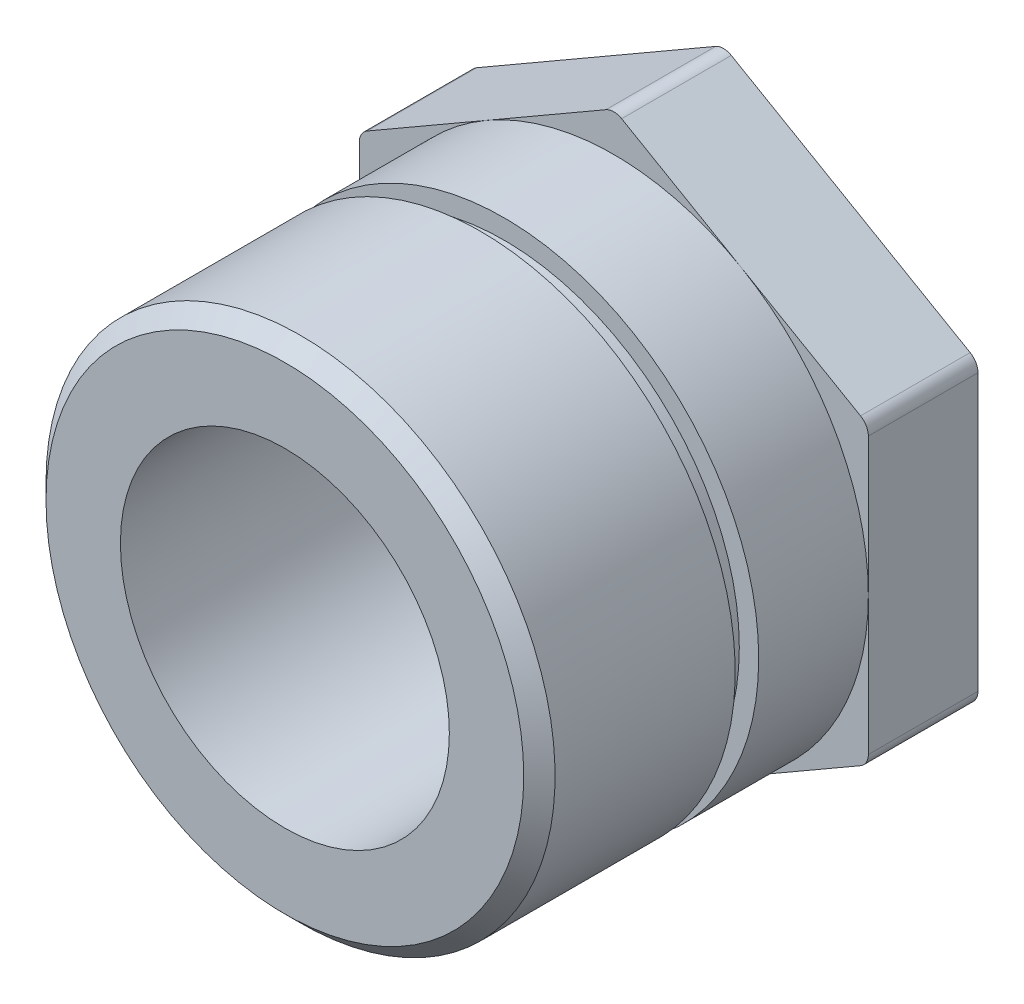
ISO-10303-21;
HEADER;
FILE_DESCRIPTION(('STEP AP214'),'2;1');
FILE_NAME('part.step','',(''),(''),'','','');
FILE_SCHEMA(('AUTOMOTIVE_DESIGN { 1 0 10303 214 1 1 1 1 }'));
ENDSEC;
DATA;
#1=APPLICATION_CONTEXT('core data for automotive mechanical design processes');
#2=APPLICATION_PROTOCOL_DEFINITION('international standard','automotive_design',2000,#1);
#3=PRODUCT_CONTEXT('',#1,'mechanical');
#4=PRODUCT('Part','Part','',(#3));
#5=PRODUCT_RELATED_PRODUCT_CATEGORY('part','',(#4));
#6=PRODUCT_DEFINITION_FORMATION('','',#4);
#7=PRODUCT_DEFINITION_CONTEXT('part definition',#1,'design');
#8=PRODUCT_DEFINITION('design','',#6,#7);
#9=PRODUCT_DEFINITION_SHAPE('','',#8);
#10=(LENGTH_UNIT() NAMED_UNIT(*) SI_UNIT(.MILLI.,.METRE.));
#11=(NAMED_UNIT(*) PLANE_ANGLE_UNIT() SI_UNIT($,.RADIAN.));
#12=(NAMED_UNIT(*) SI_UNIT($,.STERADIAN.) SOLID_ANGLE_UNIT());
#13=UNCERTAINTY_MEASURE_WITH_UNIT(LENGTH_MEASURE(1.E-05),#10,'distance_accuracy_value','');
#14=(GEOMETRIC_REPRESENTATION_CONTEXT(3) GLOBAL_UNCERTAINTY_ASSIGNED_CONTEXT((#13)) GLOBAL_UNIT_ASSIGNED_CONTEXT((#10,
#11,#12)) REPRESENTATION_CONTEXT('',''));
#15=CARTESIAN_POINT('',(0.,0.,0.));
#16=DIRECTION('',(0.,0.,1.));
#17=DIRECTION('',(1.,0.,0.));
#18=AXIS2_PLACEMENT_3D('',#15,#16,#17);
#19=CARTESIAN_POINT('',(0.,0.,42.));
#20=DIRECTION('',(0.,0.,-1.));
#21=DIRECTION('',(-1.,0.,0.));
#22=AXIS2_PLACEMENT_3D('',#19,#20,#21);
#23=CYLINDRICAL_SURFACE('',#22,32.5);
#24=CARTESIAN_POINT('',(0.,0.,40.0000000000001));
#25=DIRECTION('',(0.,0.,1.));
#26=DIRECTION('',(1.,0.,0.));
#27=AXIS2_PLACEMENT_3D('',#24,#25,#26);
#28=CIRCLE('',#27,32.5);
#29=CARTESIAN_POINT('',(-32.5,0.,40.0000000000001));
#30=VERTEX_POINT('',#29);
#31=EDGE_CURVE('E11',#30,#30,#28,.F.);
#32=CARTESIAN_POINT('',(0.,0.,17.));
#33=DIRECTION('',(0.,0.,1.));
#34=DIRECTION('',(1.,0.,0.));
#35=AXIS2_PLACEMENT_3D('',#32,#33,#34);
#36=CIRCLE('',#35,32.5);
#37=CARTESIAN_POINT('',(-32.5,0.,17.));
#38=VERTEX_POINT('',#37);
#39=EDGE_CURVE('E303',#38,#38,#36,.T.);
#40=CARTESIAN_POINT('',(-32.5,0.,40.0000000000001));
#41=CARTESIAN_POINT('',(-32.5,0.,39.7604166666667));
#42=CARTESIAN_POINT('',(-32.5,0.,39.5208333333334));
#43=CARTESIAN_POINT('',(-32.5,0.,39.0416666666667));
#44=CARTESIAN_POINT('',(-32.5,0.,38.8020833333334));
#45=CARTESIAN_POINT('',(-32.5,0.,38.3229166666667));
#46=CARTESIAN_POINT('',(-32.5,0.,38.0833333333334));
#47=CARTESIAN_POINT('',(-32.5,0.,37.6041666666667));
#48=CARTESIAN_POINT('',(-32.5,0.,37.3645833333334));
#49=CARTESIAN_POINT('',(-32.5,0.,36.8854166666667));
#50=CARTESIAN_POINT('',(-32.5,0.,36.6458333333334));
#51=CARTESIAN_POINT('',(-32.5,0.,36.1666666666667));
#52=CARTESIAN_POINT('',(-32.5,0.,35.9270833333334));
#53=CARTESIAN_POINT('',(-32.5,0.,35.4479166666667));
#54=CARTESIAN_POINT('',(-32.5,0.,35.2083333333334));
#55=CARTESIAN_POINT('',(-32.5,0.,34.7291666666667));
#56=CARTESIAN_POINT('',(-32.5,0.,34.4895833333334));
#57=CARTESIAN_POINT('',(-32.5,0.,34.0104166666667));
#58=CARTESIAN_POINT('',(-32.5,0.,33.7708333333334));
#59=CARTESIAN_POINT('',(-32.5,0.,33.2916666666667));
#60=CARTESIAN_POINT('',(-32.5,0.,33.0520833333334));
#61=CARTESIAN_POINT('',(-32.5,0.,32.5729166666667));
#62=CARTESIAN_POINT('',(-32.5,0.,32.3333333333334));
#63=CARTESIAN_POINT('',(-32.5,0.,31.8541666666667));
#64=CARTESIAN_POINT('',(-32.5,0.,31.6145833333334));
#65=CARTESIAN_POINT('',(-32.5,0.,31.1354166666667));
#66=CARTESIAN_POINT('',(-32.5,0.,30.8958333333334));
#67=CARTESIAN_POINT('',(-32.5,0.,30.4166666666667));
#68=CARTESIAN_POINT('',(-32.5,0.,30.1770833333334));
#69=CARTESIAN_POINT('',(-32.5,0.,29.6979166666667));
#70=CARTESIAN_POINT('',(-32.5,0.,29.4583333333334));
#71=CARTESIAN_POINT('',(-32.5,0.,28.9791666666667));
#72=CARTESIAN_POINT('',(-32.5,0.,28.7395833333334));
#73=CARTESIAN_POINT('',(-32.5,0.,28.2604166666667));
#74=CARTESIAN_POINT('',(-32.5,0.,28.0208333333334));
#75=CARTESIAN_POINT('',(-32.5,0.,27.5416666666667));
#76=CARTESIAN_POINT('',(-32.5,0.,27.3020833333334));
#77=CARTESIAN_POINT('',(-32.5,0.,26.8229166666667));
#78=CARTESIAN_POINT('',(-32.5,0.,26.5833333333333));
#79=CARTESIAN_POINT('',(-32.5,0.,26.1041666666667));
#80=CARTESIAN_POINT('',(-32.5,0.,25.8645833333333));
#81=CARTESIAN_POINT('',(-32.5,0.,25.3854166666667));
#82=CARTESIAN_POINT('',(-32.5,0.,25.1458333333333));
#83=CARTESIAN_POINT('',(-32.5,0.,24.6666666666667));
#84=CARTESIAN_POINT('',(-32.5,0.,24.4270833333333));
#85=CARTESIAN_POINT('',(-32.5,0.,23.9479166666667));
#86=CARTESIAN_POINT('',(-32.5,0.,23.7083333333333));
#87=CARTESIAN_POINT('',(-32.5,0.,23.2291666666667));
#88=CARTESIAN_POINT('',(-32.5,0.,22.9895833333333));
#89=CARTESIAN_POINT('',(-32.5,0.,22.5104166666667));
#90=CARTESIAN_POINT('',(-32.5,0.,22.2708333333333));
#91=CARTESIAN_POINT('',(-32.5,0.,21.7916666666667));
#92=CARTESIAN_POINT('',(-32.5,0.,21.5520833333333));
#93=CARTESIAN_POINT('',(-32.5,0.,21.0729166666667));
#94=CARTESIAN_POINT('',(-32.5,0.,20.8333333333333));
#95=CARTESIAN_POINT('',(-32.5,0.,20.3541666666667));
#96=CARTESIAN_POINT('',(-32.5,0.,20.1145833333333));
#97=CARTESIAN_POINT('',(-32.5,0.,19.6354166666667));
#98=CARTESIAN_POINT('',(-32.5,0.,19.3958333333333));
#99=CARTESIAN_POINT('',(-32.5,0.,18.9166666666667));
#100=CARTESIAN_POINT('',(-32.5,0.,18.6770833333333));
#101=CARTESIAN_POINT('',(-32.5,0.,18.1979166666667));
#102=CARTESIAN_POINT('',(-32.5,0.,17.9583333333333));
#103=CARTESIAN_POINT('',(-32.5,0.,17.4791666666667));
#104=CARTESIAN_POINT('',(-32.5,0.,17.2395833333333));
#105=CARTESIAN_POINT('',(-32.5,0.,17.));
#106=B_SPLINE_CURVE_WITH_KNOTS('',3,(#40,#41,#42,#43,#44,#45,#46,#47,#48,#49,#50,#51,#52,#53,
#54,#55,#56,#57,#58,#59,#60,#61,#62,#63,#64,#65,#66,#67,#68,#69,#70,#71,#72,#73,#74,#75,#76,#77,
#78,#79,#80,#81,#82,#83,#84,#85,#86,#87,#88,#89,#90,#91,#92,#93,#94,#95,#96,#97,#98,#99,#100,
#101,#102,#103,#104,#105),.UNSPECIFIED.,.F.,.F.,(4,2,2,2,2,2,2,2,2,2,2,2,2,2,2,2,2,2,2,2,2,2,2,
2,2,2,2,2,2,2,2,2,4),(0.,0.718750000000004,1.43750000000001,2.15625000000001,2.87500000000001,
3.59375000000001,4.31250000000002,5.03125000000002,5.75000000000002,6.46875000000002,
7.18750000000002,7.90625000000002,8.62500000000003,9.34375000000003,10.0625,10.78125,11.5,
12.21875,12.9375,13.65625,14.375,15.09375,15.8125,16.53125,17.25,17.96875,18.6875000000001,
19.4062500000001,20.1250000000001,20.8437500000001,21.5625000000001,22.2812500000001,
23.0000000000001),.UNSPECIFIED.);
#107=EDGE_CURVE('BSEAM43',#30,#38,#106,.T.);
#108=ORIENTED_EDGE('',*,*,#31,.T.);
#109=ORIENTED_EDGE('',*,*,#39,.T.);
#110=ORIENTED_EDGE('',*,*,#107,.T.);
#111=ORIENTED_EDGE('',*,*,#107,.F.);
#112=EDGE_LOOP('',(#108,#110,#109,#111));
#113=FACE_BOUND('',#112,.T.);
#114=ADVANCED_FACE('F43',(#113),#23,.T.);
#115=CARTESIAN_POINT('',(0.,0.,42.));
#116=DIRECTION('',(0.,0.,1.));
#117=DIRECTION('',(1.,0.,0.));
#118=AXIS2_PLACEMENT_3D('',#115,#116,#117);
#119=PLANE('',#118);
#120=CARTESIAN_POINT('',(0.,0.,42.));
#121=DIRECTION('',(0.,0.,1.));
#122=DIRECTION('',(1.,0.,0.));
#123=AXIS2_PLACEMENT_3D('',#120,#121,#122);
#124=CIRCLE('',#123,21.);
#125=CARTESIAN_POINT('',(21.,0.,42.));
#126=VERTEX_POINT('',#125);
#127=EDGE_CURVE('E355',#126,#126,#124,.T.);
#128=ORIENTED_EDGE('',*,*,#127,.F.);
#129=EDGE_LOOP('',(#128));
#130=FACE_BOUND('',#129,.T.);
#131=CARTESIAN_POINT('',(0.,0.,42.));
#132=DIRECTION('',(0.,0.,1.));
#133=DIRECTION('',(1.,0.,0.));
#134=AXIS2_PLACEMENT_3D('',#131,#132,#133);
#135=CIRCLE('',#134,30.5);
#136=CARTESIAN_POINT('',(30.5,0.,42.));
#137=VERTEX_POINT('',#136);
#138=EDGE_CURVE('E52',#137,#137,#135,.T.);
#139=ORIENTED_EDGE('',*,*,#138,.T.);
#140=EDGE_LOOP('',(#139));
#141=FACE_BOUND('',#140,.T.);
#142=ADVANCED_FACE('F244',(#130,#141),#119,.T.);
#143=CARTESIAN_POINT('',(0.,0.,17.));
#144=DIRECTION('',(0.,0.,1.));
#145=DIRECTION('',(1.,0.,0.));
#146=AXIS2_PLACEMENT_3D('',#143,#144,#145);
#147=PLANE('',#146);
#148=ORIENTED_EDGE('',*,*,#39,.F.);
#149=EDGE_LOOP('',(#148));
#150=FACE_BOUND('',#149,.T.);
#151=CARTESIAN_POINT('',(0.,0.,17.));
#152=DIRECTION('',(0.,0.,1.));
#153=DIRECTION('',(1.,0.,0.));
#154=AXIS2_PLACEMENT_3D('',#151,#152,#153);
#155=CIRCLE('',#154,30.0241150466177);
#156=CARTESIAN_POINT('',(30.0241150466177,0.,17.));
#157=VERTEX_POINT('',#156);
#158=EDGE_CURVE('E305',#157,#157,#155,.T.);
#159=ORIENTED_EDGE('',*,*,#158,.T.);
#160=EDGE_LOOP('',(#159));
#161=FACE_BOUND('',#160,.T.);
#162=ADVANCED_FACE('F267',(#150,#161),#147,.F.);
#163=CARTESIAN_POINT('',(0.,0.,14.));
#164=DIRECTION('',(0.,0.,1.));
#165=DIRECTION('',(1.,0.,0.));
#166=AXIS2_PLACEMENT_3D('',#163,#164,#165);
#167=PLANE('',#166);
#168=CARTESIAN_POINT('',(0.,0.,14.));
#169=DIRECTION('',(0.,0.,1.));
#170=DIRECTION('',(1.,0.,0.));
#171=AXIS2_PLACEMENT_3D('',#168,#169,#170);
#172=CIRCLE('',#171,32.5);
#173=CARTESIAN_POINT('',(32.5,0.,14.));
#174=VERTEX_POINT('',#173);
#175=EDGE_CURVE('E192',#174,#174,#172,.T.);
#176=ORIENTED_EDGE('',*,*,#175,.T.);
#177=EDGE_LOOP('',(#176));
#178=FACE_BOUND('',#177,.T.);
#179=CARTESIAN_POINT('',(0.,0.,14.));
#180=DIRECTION('',(0.,0.,1.));
#181=DIRECTION('',(1.,0.,0.));
#182=AXIS2_PLACEMENT_3D('',#179,#180,#181);
#183=CIRCLE('',#182,30.0241150466177);
#184=CARTESIAN_POINT('',(30.0241150466177,0.,14.));
#185=VERTEX_POINT('',#184);
#186=EDGE_CURVE('E306',#185,#185,#183,.T.);
#187=ORIENTED_EDGE('',*,*,#186,.F.);
#188=EDGE_LOOP('',(#187));
#189=FACE_BOUND('',#188,.T.);
#190=ADVANCED_FACE('F283',(#178,#189),#167,.T.);
#191=CARTESIAN_POINT('',(0.,0.,17.));
#192=DIRECTION('',(0.,0.,-1.));
#193=DIRECTION('',(-1.,0.,0.));
#194=AXIS2_PLACEMENT_3D('',#191,#192,#193);
#195=CYLINDRICAL_SURFACE('',#194,30.0241150466177);
#196=ORIENTED_EDGE('',*,*,#158,.F.);
#197=EDGE_LOOP('',(#196));
#198=FACE_BOUND('',#197,.T.);
#199=ORIENTED_EDGE('',*,*,#186,.T.);
#200=EDGE_LOOP('',(#199));
#201=FACE_BOUND('',#200,.T.);
#202=ADVANCED_FACE('F274',(#198,#201),#195,.T.);
#203=CARTESIAN_POINT('',(0.,0.,0.));
#204=DIRECTION('',(0.,0.,1.));
#205=DIRECTION('',(1.,0.,0.));
#206=AXIS2_PLACEMENT_3D('',#203,#204,#205);
#207=CIRCLE('',#206,32.5);
#208=CARTESIAN_POINT('',(32.5,0.,0.));
#209=VERTEX_POINT('',#208);
#210=CARTESIAN_POINT('',(16.25,28.1458256229943,0.));
#211=VERTEX_POINT('',#210);
#212=EDGE_CURVE('E187',#209,#211,#207,.T.);
#213=ORIENTED_EDGE('',*,*,#212,.T.);
#214=CARTESIAN_POINT('',(-16.25,28.1458256229943,0.));
#215=VERTEX_POINT('',#214);
#216=EDGE_CURVE('E174',#211,#215,#207,.T.);
#217=ORIENTED_EDGE('',*,*,#216,.T.);
#218=CARTESIAN_POINT('',(-32.5,0.,0.));
#219=VERTEX_POINT('',#218);
#220=EDGE_CURVE('E167',#215,#219,#207,.T.);
#221=ORIENTED_EDGE('',*,*,#220,.T.);
#222=CARTESIAN_POINT('',(-16.25,-28.1458256229943,0.));
#223=VERTEX_POINT('',#222);
#224=EDGE_CURVE('E175',#219,#223,#207,.T.);
#225=ORIENTED_EDGE('',*,*,#224,.T.);
#226=CARTESIAN_POINT('',(16.25,-28.1458256229943,0.));
#227=VERTEX_POINT('',#226);
#228=EDGE_CURVE('E315',#223,#227,#207,.T.);
#229=ORIENTED_EDGE('',*,*,#228,.T.);
#230=EDGE_CURVE('E189',#227,#209,#207,.T.);
#231=ORIENTED_EDGE('',*,*,#230,.T.);
#232=EDGE_LOOP('',(#213,#217,#221,#225,#229,#231));
#233=FACE_BOUND('',#232,.T.);
#234=ORIENTED_EDGE('',*,*,#175,.F.);
#235=EDGE_LOOP('',(#234));
#236=FACE_BOUND('',#235,.T.);
#237=ADVANCED_FACE('F183',(#233,#236),#23,.T.);
#238=CARTESIAN_POINT('',(0.,0.,0.));
#239=DIRECTION('',(0.,0.,-1.));
#240=DIRECTION('',(-1.,0.,0.));
#241=AXIS2_PLACEMENT_3D('',#238,#239,#240);
#242=PLANE('',#241);
#243=DIRECTION('',(0.,-1.,0.));
#244=VECTOR('',#243,1.);
#245=CARTESIAN_POINT('',(32.5,18.7638837486628,0.));
#246=LINE('',#245,#244);
#247=CARTESIAN_POINT('',(32.5,17.6091832102836,0.));
#248=VERTEX_POINT('',#247);
#249=EDGE_CURVE('E333',#248,#209,#246,.T.);
#250=ORIENTED_EDGE('',*,*,#249,.F.);
#251=CARTESIAN_POINT('',(30.5,17.6091832102836,0.));
#252=DIRECTION('',(0.,0.,-1.));
#253=DIRECTION('',(-1.,0.,0.));
#254=AXIS2_PLACEMENT_3D('',#251,#252,#253);
#255=CIRCLE('',#254,2.);
#256=CARTESIAN_POINT('',(31.5,19.3412340178525,0.));
#257=VERTEX_POINT('',#256);
#258=EDGE_CURVE('E67',#248,#257,#255,.F.);
#259=ORIENTED_EDGE('',*,*,#258,.T.);
#260=DIRECTION('',(0.866025403784439,-0.5,0.));
#261=VECTOR('',#260,1.);
#262=CARTESIAN_POINT('',(0.,37.5277674973257,0.));
#263=LINE('',#262,#261);
#264=EDGE_CURVE('E163',#211,#257,#263,.T.);
#265=ORIENTED_EDGE('',*,*,#264,.F.);
#266=ORIENTED_EDGE('',*,*,#212,.F.);
#267=EDGE_LOOP('',(#250,#259,#265,#266));
#268=FACE_BOUND('',#267,.T.);
#269=ADVANCED_FACE('F273',(#268),#242,.F.);
#270=CARTESIAN_POINT('',(1.,36.950417228136,0.));
#271=VERTEX_POINT('',#270);
#272=EDGE_CURVE('E336',#271,#211,#263,.T.);
#273=ORIENTED_EDGE('',*,*,#272,.F.);
#274=CARTESIAN_POINT('',(0.,35.2183664205672,0.));
#275=DIRECTION('',(0.,0.,-1.));
#276=DIRECTION('',(-1.,0.,0.));
#277=AXIS2_PLACEMENT_3D('',#274,#275,#276);
#278=CIRCLE('',#277,2.);
#279=CARTESIAN_POINT('',(-1.,36.950417228136,0.));
#280=VERTEX_POINT('',#279);
#281=EDGE_CURVE('E59',#271,#280,#278,.F.);
#282=ORIENTED_EDGE('',*,*,#281,.T.);
#283=DIRECTION('',(0.866025403784439,0.5,0.));
#284=VECTOR('',#283,1.);
#285=CARTESIAN_POINT('',(-32.5,18.7638837486628,0.));
#286=LINE('',#285,#284);
#287=EDGE_CURVE('E159',#215,#280,#286,.T.);
#288=ORIENTED_EDGE('',*,*,#287,.F.);
#289=ORIENTED_EDGE('',*,*,#216,.F.);
#290=EDGE_LOOP('',(#273,#282,#288,#289));
#291=FACE_BOUND('',#290,.T.);
#292=ADVANCED_FACE('F180',(#291),#242,.F.);
#293=CARTESIAN_POINT('',(-31.5,19.3412340178525,0.));
#294=VERTEX_POINT('',#293);
#295=EDGE_CURVE('E154',#294,#215,#286,.T.);
#296=ORIENTED_EDGE('',*,*,#295,.F.);
#297=CARTESIAN_POINT('',(-30.5,17.6091832102836,0.));
#298=DIRECTION('',(0.,0.,-1.));
#299=DIRECTION('',(-1.,0.,0.));
#300=AXIS2_PLACEMENT_3D('',#297,#298,#299);
#301=CIRCLE('',#300,2.);
#302=CARTESIAN_POINT('',(-32.5,17.6091832102836,0.));
#303=VERTEX_POINT('',#302);
#304=EDGE_CURVE('E196',#294,#303,#301,.F.);
#305=ORIENTED_EDGE('',*,*,#304,.T.);
#306=DIRECTION('',(0.,1.,0.));
#307=VECTOR('',#306,1.);
#308=CARTESIAN_POINT('',(-32.5,-18.7638837486628,0.));
#309=LINE('',#308,#307);
#310=EDGE_CURVE('E170',#219,#303,#309,.T.);
#311=ORIENTED_EDGE('',*,*,#310,.F.);
#312=ORIENTED_EDGE('',*,*,#220,.F.);
#313=EDGE_LOOP('',(#296,#305,#311,#312));
#314=FACE_BOUND('',#313,.T.);
#315=ADVANCED_FACE('F168',(#314),#242,.F.);
#316=CARTESIAN_POINT('',(-32.5,-17.6091832102836,0.));
#317=VERTEX_POINT('',#316);
#318=EDGE_CURVE('E313',#317,#219,#309,.T.);
#319=ORIENTED_EDGE('',*,*,#318,.F.);
#320=CARTESIAN_POINT('',(-30.5,-17.6091832102836,0.));
#321=DIRECTION('',(0.,0.,-1.));
#322=DIRECTION('',(-1.,0.,0.));
#323=AXIS2_PLACEMENT_3D('',#320,#321,#322);
#324=CIRCLE('',#323,2.);
#325=CARTESIAN_POINT('',(-31.5,-19.3412340178525,0.));
#326=VERTEX_POINT('',#325);
#327=EDGE_CURVE('E240',#317,#326,#324,.F.);
#328=ORIENTED_EDGE('',*,*,#327,.T.);
#329=DIRECTION('',(-0.866025403784439,0.5,0.));
#330=VECTOR('',#329,1.);
#331=CARTESIAN_POINT('',(0.,-37.5277674973257,0.));
#332=LINE('',#331,#330);
#333=EDGE_CURVE('E325',#223,#326,#332,.T.);
#334=ORIENTED_EDGE('',*,*,#333,.F.);
#335=ORIENTED_EDGE('',*,*,#224,.F.);
#336=EDGE_LOOP('',(#319,#328,#334,#335));
#337=FACE_BOUND('',#336,.T.);
#338=ADVANCED_FACE('F323',(#337),#242,.F.);
#339=CARTESIAN_POINT('',(-0.999999999999999,-36.950417228136,0.));
#340=VERTEX_POINT('',#339);
#341=EDGE_CURVE('E328',#340,#223,#332,.T.);
#342=ORIENTED_EDGE('',*,*,#341,.F.);
#343=CARTESIAN_POINT('',(0.,-35.2183664205672,0.));
#344=DIRECTION('',(0.,0.,-1.));
#345=DIRECTION('',(-1.,0.,0.));
#346=AXIS2_PLACEMENT_3D('',#343,#344,#345);
#347=CIRCLE('',#346,2.);
#348=CARTESIAN_POINT('',(1.00000000000001,-36.950417228136,0.));
#349=VERTEX_POINT('',#348);
#350=EDGE_CURVE('E220',#340,#349,#347,.F.);
#351=ORIENTED_EDGE('',*,*,#350,.T.);
#352=DIRECTION('',(-0.866025403784439,-0.5,0.));
#353=VECTOR('',#352,1.);
#354=CARTESIAN_POINT('',(32.5,-18.7638837486628,0.));
#355=LINE('',#354,#353);
#356=EDGE_CURVE('E330',#227,#349,#355,.T.);
#357=ORIENTED_EDGE('',*,*,#356,.F.);
#358=ORIENTED_EDGE('',*,*,#228,.F.);
#359=EDGE_LOOP('',(#342,#351,#357,#358));
#360=FACE_BOUND('',#359,.T.);
#361=ADVANCED_FACE('F386',(#360),#242,.F.);
#362=CARTESIAN_POINT('',(-32.5,18.7638837486628,-14.));
#363=DIRECTION('',(0.5,-0.866025403784439,0.));
#364=DIRECTION('',(0.866025403784439,0.5,0.));
#365=AXIS2_PLACEMENT_3D('',#362,#363,#364);
#366=PLANE('',#365);
#367=DIRECTION('',(0.866025403784439,0.5,0.));
#368=VECTOR('',#367,1.);
#369=CARTESIAN_POINT('',(-32.5,18.7638837486628,-14.));
#370=LINE('',#369,#368);
#371=CARTESIAN_POINT('',(-31.5,19.3412340178525,-14.));
#372=VERTEX_POINT('',#371);
#373=CARTESIAN_POINT('',(-1.,36.950417228136,-14.));
#374=VERTEX_POINT('',#373);
#375=EDGE_CURVE('E352',#372,#374,#370,.T.);
#376=ORIENTED_EDGE('',*,*,#375,.F.);
#377=DIRECTION('',(0.,0.,1.));
#378=VECTOR('',#377,1.);
#379=CARTESIAN_POINT('',(-31.5,19.3412340178525,-14.));
#380=LINE('',#379,#378);
#381=EDGE_CURVE('E161',#372,#294,#380,.T.);
#382=ORIENTED_EDGE('',*,*,#381,.T.);
#383=ORIENTED_EDGE('',*,*,#295,.T.);
#384=ORIENTED_EDGE('',*,*,#287,.T.);
#385=DIRECTION('',(0.,0.,1.));
#386=VECTOR('',#385,1.);
#387=CARTESIAN_POINT('',(-1.,36.950417228136,-14.));
#388=LINE('',#387,#386);
#389=EDGE_CURVE('E188',#280,#374,#388,.F.);
#390=ORIENTED_EDGE('',*,*,#389,.T.);
#391=EDGE_LOOP('',(#376,#382,#383,#384,#390));
#392=FACE_BOUND('',#391,.T.);
#393=ADVANCED_FACE('F157',(#392),#366,.F.);
#394=CARTESIAN_POINT('',(0.,37.5277674973257,-14.));
#395=DIRECTION('',(-0.5,-0.866025403784439,0.));
#396=DIRECTION('',(0.866025403784439,-0.5,0.));
#397=AXIS2_PLACEMENT_3D('',#394,#395,#396);
#398=PLANE('',#397);
#399=ORIENTED_EDGE('',*,*,#264,.T.);
#400=DIRECTION('',(0.,0.,1.));
#401=VECTOR('',#400,1.);
#402=CARTESIAN_POINT('',(31.5,19.3412340178525,-14.));
#403=LINE('',#402,#401);
#404=CARTESIAN_POINT('',(31.5,19.3412340178525,-14.));
#405=VERTEX_POINT('',#404);
#406=EDGE_CURVE('E237',#257,#405,#403,.F.);
#407=ORIENTED_EDGE('',*,*,#406,.T.);
#408=DIRECTION('',(0.866025403784439,-0.5,0.));
#409=VECTOR('',#408,1.);
#410=CARTESIAN_POINT('',(0.,37.5277674973257,-14.));
#411=LINE('',#410,#409);
#412=CARTESIAN_POINT('',(1.,36.950417228136,-14.));
#413=VERTEX_POINT('',#412);
#414=EDGE_CURVE('E349',#413,#405,#411,.T.);
#415=ORIENTED_EDGE('',*,*,#414,.F.);
#416=DIRECTION('',(0.,0.,1.));
#417=VECTOR('',#416,1.);
#418=CARTESIAN_POINT('',(1.,36.950417228136,-14.));
#419=LINE('',#418,#417);
#420=EDGE_CURVE('E235',#413,#271,#419,.T.);
#421=ORIENTED_EDGE('',*,*,#420,.T.);
#422=ORIENTED_EDGE('',*,*,#272,.T.);
#423=EDGE_LOOP('',(#399,#407,#415,#421,#422));
#424=FACE_BOUND('',#423,.T.);
#425=ADVANCED_FACE('F400',(#424),#398,.F.);
#426=CARTESIAN_POINT('',(32.5,18.7638837486628,-14.));
#427=DIRECTION('',(-1.,0.,0.));
#428=DIRECTION('',(0.,-1.,0.));
#429=AXIS2_PLACEMENT_3D('',#426,#427,#428);
#430=PLANE('',#429);
#431=CARTESIAN_POINT('',(32.5,-17.6091832102836,0.));
#432=VERTEX_POINT('',#431);
#433=EDGE_CURVE('E335',#209,#432,#246,.T.);
#434=ORIENTED_EDGE('',*,*,#433,.T.);
#435=DIRECTION('',(0.,0.,1.));
#436=VECTOR('',#435,1.);
#437=CARTESIAN_POINT('',(32.5,-17.6091832102836,-14.));
#438=LINE('',#437,#436);
#439=CARTESIAN_POINT('',(32.5,-17.6091832102836,-14.));
#440=VERTEX_POINT('',#439);
#441=EDGE_CURVE('E232',#432,#440,#438,.F.);
#442=ORIENTED_EDGE('',*,*,#441,.T.);
#443=DIRECTION('',(0.,-1.,0.));
#444=VECTOR('',#443,1.);
#445=CARTESIAN_POINT('',(32.5,18.7638837486628,-14.));
#446=LINE('',#445,#444);
#447=CARTESIAN_POINT('',(32.5,17.6091832102836,-14.));
#448=VERTEX_POINT('',#447);
#449=EDGE_CURVE('E346',#448,#440,#446,.T.);
#450=ORIENTED_EDGE('',*,*,#449,.F.);
#451=DIRECTION('',(0.,0.,1.));
#452=VECTOR('',#451,1.);
#453=CARTESIAN_POINT('',(32.5,17.6091832102836,-14.));
#454=LINE('',#453,#452);
#455=EDGE_CURVE('E229',#448,#248,#454,.T.);
#456=ORIENTED_EDGE('',*,*,#455,.T.);
#457=ORIENTED_EDGE('',*,*,#249,.T.);
#458=EDGE_LOOP('',(#434,#442,#450,#456,#457));
#459=FACE_BOUND('',#458,.T.);
#460=ADVANCED_FACE('F408',(#459),#430,.F.);
#461=CARTESIAN_POINT('',(32.5,-18.7638837486628,-14.));
#462=DIRECTION('',(-0.5,0.866025403784439,0.));
#463=DIRECTION('',(-0.866025403784439,-0.5,0.));
#464=AXIS2_PLACEMENT_3D('',#461,#462,#463);
#465=PLANE('',#464);
#466=ORIENTED_EDGE('',*,*,#356,.T.);
#467=DIRECTION('',(0.,0.,1.));
#468=VECTOR('',#467,1.);
#469=CARTESIAN_POINT('',(1.,-36.950417228136,-14.));
#470=LINE('',#469,#468);
#471=CARTESIAN_POINT('',(1.00000000000001,-36.950417228136,-14.));
#472=VERTEX_POINT('',#471);
#473=EDGE_CURVE('E225',#349,#472,#470,.F.);
#474=ORIENTED_EDGE('',*,*,#473,.T.);
#475=DIRECTION('',(-0.866025403784439,-0.5,0.));
#476=VECTOR('',#475,1.);
#477=CARTESIAN_POINT('',(32.5,-18.7638837486628,-14.));
#478=LINE('',#477,#476);
#479=CARTESIAN_POINT('',(31.5,-19.3412340178525,-14.));
#480=VERTEX_POINT('',#479);
#481=EDGE_CURVE('E343',#480,#472,#478,.T.);
#482=ORIENTED_EDGE('',*,*,#481,.F.);
#483=DIRECTION('',(0.,0.,1.));
#484=VECTOR('',#483,1.);
#485=CARTESIAN_POINT('',(31.5,-19.3412340178525,-14.));
#486=LINE('',#485,#484);
#487=CARTESIAN_POINT('',(31.5,-19.3412340178525,0.));
#488=VERTEX_POINT('',#487);
#489=EDGE_CURVE('E222',#480,#488,#486,.T.);
#490=ORIENTED_EDGE('',*,*,#489,.T.);
#491=EDGE_CURVE('E329',#488,#227,#355,.T.);
#492=ORIENTED_EDGE('',*,*,#491,.T.);
#493=EDGE_LOOP('',(#466,#474,#482,#490,#492));
#494=FACE_BOUND('',#493,.T.);
#495=ADVANCED_FACE('F390',(#494),#465,.F.);
#496=CARTESIAN_POINT('',(0.,-37.5277674973257,-14.));
#497=DIRECTION('',(0.5,0.866025403784439,0.));
#498=DIRECTION('',(-0.866025403784439,0.5,0.));
#499=AXIS2_PLACEMENT_3D('',#496,#497,#498);
#500=PLANE('',#499);
#501=DIRECTION('',(-0.866025403784439,0.5,0.));
#502=VECTOR('',#501,1.);
#503=CARTESIAN_POINT('',(0.,-37.5277674973257,-14.));
#504=LINE('',#503,#502);
#505=CARTESIAN_POINT('',(-0.999999999999999,-36.950417228136,-14.));
#506=VERTEX_POINT('',#505);
#507=CARTESIAN_POINT('',(-31.5,-19.3412340178525,-14.));
#508=VERTEX_POINT('',#507);
#509=EDGE_CURVE('E340',#506,#508,#504,.T.);
#510=ORIENTED_EDGE('',*,*,#509,.F.);
#511=DIRECTION('',(0.,0.,1.));
#512=VECTOR('',#511,1.);
#513=CARTESIAN_POINT('',(-0.999999999999999,-36.950417228136,-14.));
#514=LINE('',#513,#512);
#515=EDGE_CURVE('E217',#506,#340,#514,.T.);
#516=ORIENTED_EDGE('',*,*,#515,.T.);
#517=ORIENTED_EDGE('',*,*,#341,.T.);
#518=ORIENTED_EDGE('',*,*,#333,.T.);
#519=DIRECTION('',(0.,0.,1.));
#520=VECTOR('',#519,1.);
#521=CARTESIAN_POINT('',(-31.5,-19.3412340178525,-14.));
#522=LINE('',#521,#520);
#523=EDGE_CURVE('E215',#326,#508,#522,.F.);
#524=ORIENTED_EDGE('',*,*,#523,.T.);
#525=EDGE_LOOP('',(#510,#516,#517,#518,#524));
#526=FACE_BOUND('',#525,.T.);
#527=ADVANCED_FACE('F377',(#526),#500,.F.);
#528=CARTESIAN_POINT('',(-32.5,-18.7638837486628,-14.));
#529=DIRECTION('',(1.,0.,0.));
#530=DIRECTION('',(0.,1.,0.));
#531=AXIS2_PLACEMENT_3D('',#528,#529,#530);
#532=PLANE('',#531);
#533=ORIENTED_EDGE('',*,*,#310,.T.);
#534=DIRECTION('',(0.,0.,1.));
#535=VECTOR('',#534,1.);
#536=CARTESIAN_POINT('',(-32.5,17.6091832102836,-14.));
#537=LINE('',#536,#535);
#538=CARTESIAN_POINT('',(-32.5,17.6091832102836,-14.));
#539=VERTEX_POINT('',#538);
#540=EDGE_CURVE('E201',#303,#539,#537,.F.);
#541=ORIENTED_EDGE('',*,*,#540,.T.);
#542=DIRECTION('',(0.,1.,0.));
#543=VECTOR('',#542,1.);
#544=CARTESIAN_POINT('',(-32.5,-18.7638837486628,-14.));
#545=LINE('',#544,#543);
#546=CARTESIAN_POINT('',(-32.5,-17.6091832102836,-14.));
#547=VERTEX_POINT('',#546);
#548=EDGE_CURVE('E310',#547,#539,#545,.T.);
#549=ORIENTED_EDGE('',*,*,#548,.F.);
#550=DIRECTION('',(0.,0.,1.));
#551=VECTOR('',#550,1.);
#552=CARTESIAN_POINT('',(-32.5,-17.6091832102836,-14.));
#553=LINE('',#552,#551);
#554=EDGE_CURVE('E198',#547,#317,#553,.T.);
#555=ORIENTED_EDGE('',*,*,#554,.T.);
#556=ORIENTED_EDGE('',*,*,#318,.T.);
#557=EDGE_LOOP('',(#533,#541,#549,#555,#556));
#558=FACE_BOUND('',#557,.T.);
#559=ADVANCED_FACE('F366',(#558),#532,.F.);
#560=CARTESIAN_POINT('',(0.,0.,-14.));
#561=DIRECTION('',(0.,0.,-1.));
#562=DIRECTION('',(-1.,0.,0.));
#563=AXIS2_PLACEMENT_3D('',#560,#561,#562);
#564=PLANE('',#563);
#565=CARTESIAN_POINT('',(0.,0.,-14.));
#566=DIRECTION('',(0.,0.,1.));
#567=DIRECTION('',(1.,0.,0.));
#568=AXIS2_PLACEMENT_3D('',#565,#566,#567);
#569=CIRCLE('',#568,21.);
#570=CARTESIAN_POINT('',(21.,0.,-14.));
#571=VERTEX_POINT('',#570);
#572=EDGE_CURVE('E181',#571,#571,#569,.T.);
#573=ORIENTED_EDGE('',*,*,#572,.T.);
#574=EDGE_LOOP('',(#573));
#575=FACE_BOUND('',#574,.T.);
#576=ORIENTED_EDGE('',*,*,#548,.T.);
#577=CARTESIAN_POINT('',(-30.5,17.6091832102836,-14.));
#578=DIRECTION('',(0.,0.,-1.));
#579=DIRECTION('',(-1.,0.,0.));
#580=AXIS2_PLACEMENT_3D('',#577,#578,#579);
#581=CIRCLE('',#580,2.);
#582=EDGE_CURVE('E213',#539,#372,#581,.T.);
#583=ORIENTED_EDGE('',*,*,#582,.T.);
#584=ORIENTED_EDGE('',*,*,#375,.T.);
#585=CARTESIAN_POINT('',(0.,35.2183664205672,-14.));
#586=DIRECTION('',(0.,0.,-1.));
#587=DIRECTION('',(-1.,0.,0.));
#588=AXIS2_PLACEMENT_3D('',#585,#586,#587);
#589=CIRCLE('',#588,2.);
#590=EDGE_CURVE('E205',#374,#413,#589,.T.);
#591=ORIENTED_EDGE('',*,*,#590,.T.);
#592=ORIENTED_EDGE('',*,*,#414,.T.);
#593=CARTESIAN_POINT('',(30.5,17.6091832102836,-14.));
#594=DIRECTION('',(0.,0.,-1.));
#595=DIRECTION('',(-1.,0.,0.));
#596=AXIS2_PLACEMENT_3D('',#593,#594,#595);
#597=CIRCLE('',#596,2.);
#598=EDGE_CURVE('E207',#405,#448,#597,.T.);
#599=ORIENTED_EDGE('',*,*,#598,.T.);
#600=ORIENTED_EDGE('',*,*,#449,.T.);
#601=CARTESIAN_POINT('',(30.5,-17.6091832102836,-14.));
#602=DIRECTION('',(0.,0.,-1.));
#603=DIRECTION('',(-1.,0.,0.));
#604=AXIS2_PLACEMENT_3D('',#601,#602,#603);
#605=CIRCLE('',#604,2.);
#606=EDGE_CURVE('E209',#440,#480,#605,.T.);
#607=ORIENTED_EDGE('',*,*,#606,.T.);
#608=ORIENTED_EDGE('',*,*,#481,.T.);
#609=CARTESIAN_POINT('',(0.,-35.2183664205672,-14.));
#610=DIRECTION('',(0.,0.,-1.));
#611=DIRECTION('',(-1.,0.,0.));
#612=AXIS2_PLACEMENT_3D('',#609,#610,#611);
#613=CIRCLE('',#612,2.);
#614=EDGE_CURVE('E211',#472,#506,#613,.T.);
#615=ORIENTED_EDGE('',*,*,#614,.T.);
#616=ORIENTED_EDGE('',*,*,#509,.T.);
#617=CARTESIAN_POINT('',(-30.5,-17.6091832102836,-14.));
#618=DIRECTION('',(0.,0.,-1.));
#619=DIRECTION('',(-1.,0.,0.));
#620=AXIS2_PLACEMENT_3D('',#617,#618,#619);
#621=CIRCLE('',#620,2.);
#622=EDGE_CURVE('E203',#508,#547,#621,.T.);
#623=ORIENTED_EDGE('',*,*,#622,.T.);
#624=EDGE_LOOP('',(#576,#583,#584,#591,#592,#599,#600,#607,#608,#615,#616,#623));
#625=FACE_BOUND('',#624,.T.);
#626=ADVANCED_FACE('F361',(#575,#625),#564,.T.);
#627=ORIENTED_EDGE('',*,*,#491,.F.);
#628=CARTESIAN_POINT('',(30.5,-17.6091832102836,0.));
#629=DIRECTION('',(0.,0.,-1.));
#630=DIRECTION('',(-1.,0.,0.));
#631=AXIS2_PLACEMENT_3D('',#628,#629,#630);
#632=CIRCLE('',#631,2.);
#633=EDGE_CURVE('E227',#488,#432,#632,.F.);
#634=ORIENTED_EDGE('',*,*,#633,.T.);
#635=ORIENTED_EDGE('',*,*,#433,.F.);
#636=ORIENTED_EDGE('',*,*,#230,.F.);
#637=EDGE_LOOP('',(#627,#634,#635,#636));
#638=FACE_BOUND('',#637,.T.);
#639=ADVANCED_FACE('F281',(#638),#242,.F.);
#640=CARTESIAN_POINT('',(-30.5,17.6091832102836,-14.));
#641=DIRECTION('',(0.,0.,1.));
#642=DIRECTION('',(1.,0.,0.));
#643=AXIS2_PLACEMENT_3D('',#640,#641,#642);
#644=CYLINDRICAL_SURFACE('',#643,2.);
#645=ORIENTED_EDGE('',*,*,#582,.F.);
#646=ORIENTED_EDGE('',*,*,#540,.F.);
#647=ORIENTED_EDGE('',*,*,#304,.F.);
#648=ORIENTED_EDGE('',*,*,#381,.F.);
#649=EDGE_LOOP('',(#645,#646,#647,#648));
#650=FACE_BOUND('',#649,.T.);
#651=ADVANCED_FACE('F375',(#650),#644,.T.);
#652=CARTESIAN_POINT('',(0.,-35.2183664205672,-14.));
#653=DIRECTION('',(0.,0.,1.));
#654=DIRECTION('',(1.,0.,0.));
#655=AXIS2_PLACEMENT_3D('',#652,#653,#654);
#656=CYLINDRICAL_SURFACE('',#655,2.);
#657=ORIENTED_EDGE('',*,*,#614,.F.);
#658=ORIENTED_EDGE('',*,*,#473,.F.);
#659=ORIENTED_EDGE('',*,*,#350,.F.);
#660=ORIENTED_EDGE('',*,*,#515,.F.);
#661=EDGE_LOOP('',(#657,#658,#659,#660));
#662=FACE_BOUND('',#661,.T.);
#663=ADVANCED_FACE('F383',(#662),#656,.T.);
#664=CARTESIAN_POINT('',(30.5,-17.6091832102836,-14.));
#665=DIRECTION('',(0.,0.,1.));
#666=DIRECTION('',(1.,0.,0.));
#667=AXIS2_PLACEMENT_3D('',#664,#665,#666);
#668=CYLINDRICAL_SURFACE('',#667,2.);
#669=ORIENTED_EDGE('',*,*,#606,.F.);
#670=ORIENTED_EDGE('',*,*,#441,.F.);
#671=ORIENTED_EDGE('',*,*,#633,.F.);
#672=ORIENTED_EDGE('',*,*,#489,.F.);
#673=EDGE_LOOP('',(#669,#670,#671,#672));
#674=FACE_BOUND('',#673,.T.);
#675=ADVANCED_FACE('F410',(#674),#668,.T.);
#676=CARTESIAN_POINT('',(30.5,17.6091832102836,-14.));
#677=DIRECTION('',(0.,0.,1.));
#678=DIRECTION('',(1.,0.,0.));
#679=AXIS2_PLACEMENT_3D('',#676,#677,#678);
#680=CYLINDRICAL_SURFACE('',#679,2.);
#681=ORIENTED_EDGE('',*,*,#598,.F.);
#682=ORIENTED_EDGE('',*,*,#406,.F.);
#683=ORIENTED_EDGE('',*,*,#258,.F.);
#684=ORIENTED_EDGE('',*,*,#455,.F.);
#685=EDGE_LOOP('',(#681,#682,#683,#684));
#686=FACE_BOUND('',#685,.T.);
#687=ADVANCED_FACE('F404',(#686),#680,.T.);
#688=CARTESIAN_POINT('',(0.,35.2183664205672,-14.));
#689=DIRECTION('',(0.,0.,1.));
#690=DIRECTION('',(1.,0.,0.));
#691=AXIS2_PLACEMENT_3D('',#688,#689,#690);
#692=CYLINDRICAL_SURFACE('',#691,2.);
#693=ORIENTED_EDGE('',*,*,#590,.F.);
#694=ORIENTED_EDGE('',*,*,#389,.F.);
#695=ORIENTED_EDGE('',*,*,#281,.F.);
#696=ORIENTED_EDGE('',*,*,#420,.F.);
#697=EDGE_LOOP('',(#693,#694,#695,#696));
#698=FACE_BOUND('',#697,.T.);
#699=ADVANCED_FACE('F256',(#698),#692,.T.);
#700=CARTESIAN_POINT('',(-30.5,-17.6091832102836,-14.));
#701=DIRECTION('',(0.,0.,1.));
#702=DIRECTION('',(1.,0.,0.));
#703=AXIS2_PLACEMENT_3D('',#700,#701,#702);
#704=CYLINDRICAL_SURFACE('',#703,2.);
#705=ORIENTED_EDGE('',*,*,#622,.F.);
#706=ORIENTED_EDGE('',*,*,#523,.F.);
#707=ORIENTED_EDGE('',*,*,#327,.F.);
#708=ORIENTED_EDGE('',*,*,#554,.F.);
#709=EDGE_LOOP('',(#705,#706,#707,#708));
#710=FACE_BOUND('',#709,.T.);
#711=ADVANCED_FACE('F248',(#710),#704,.T.);
#712=CARTESIAN_POINT('',(0.,0.,42.));
#713=DIRECTION('',(0.,0.,-1.));
#714=DIRECTION('',(-1.,0.,0.));
#715=AXIS2_PLACEMENT_3D('',#712,#713,#714);
#716=CONICAL_SURFACE('',#715,30.5,0.78539816339745);
#717=ORIENTED_EDGE('',*,*,#31,.F.);
#718=EDGE_LOOP('',(#717));
#719=FACE_BOUND('',#718,.T.);
#720=ORIENTED_EDGE('',*,*,#138,.F.);
#721=EDGE_LOOP('',(#720));
#722=FACE_BOUND('',#721,.T.);
#723=ADVANCED_FACE('F46',(#719,#722),#716,.T.);
#724=CARTESIAN_POINT('',(0.,0.,-14.));
#725=DIRECTION('',(0.,0.,1.));
#726=DIRECTION('',(1.,0.,0.));
#727=AXIS2_PLACEMENT_3D('',#724,#725,#726);
#728=CYLINDRICAL_SURFACE('',#727,21.);
#729=ORIENTED_EDGE('',*,*,#572,.F.);
#730=EDGE_LOOP('',(#729));
#731=FACE_BOUND('',#730,.T.);
#732=ORIENTED_EDGE('',*,*,#127,.T.);
#733=EDGE_LOOP('',(#732));
#734=FACE_BOUND('',#733,.T.);
#735=ADVANCED_FACE('F247',(#731,#734),#728,.F.);
#736=CLOSED_SHELL('',(#114,#142,#162,#190,#202,#237,#269,#292,#315,#338,#361,#393,#425,#460,
#495,#527,#559,#626,#639,#651,#663,#675,#687,#699,#711,#723,#735));
#737=MANIFOLD_SOLID_BREP('B2',#736);
#738=ADVANCED_BREP_SHAPE_REPRESENTATION('',(#18,#737),#14);
#739=SHAPE_DEFINITION_REPRESENTATION(#9,#738);
ENDSEC;
END-ISO-10303-21;
